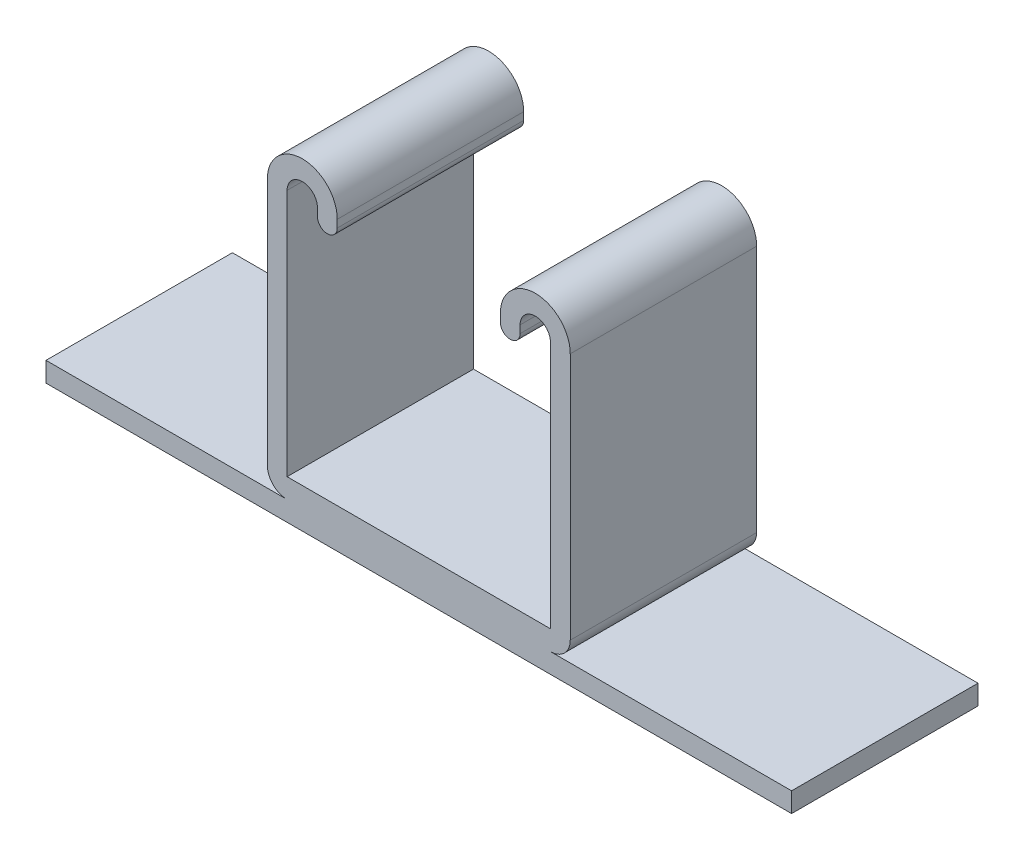
ISO-10303-21;
HEADER;
FILE_DESCRIPTION(('STEP AP214'),'2;1');
FILE_NAME('part.step','',(''),(''),'','','');
FILE_SCHEMA(('AUTOMOTIVE_DESIGN { 1 0 10303 214 1 1 1 1 }'));
ENDSEC;
DATA;
#1=APPLICATION_CONTEXT('core data for automotive mechanical design processes');
#2=APPLICATION_PROTOCOL_DEFINITION('international standard','automotive_design',2000,#1);
#3=PRODUCT_CONTEXT('',#1,'mechanical');
#4=PRODUCT('Part','Part','',(#3));
#5=PRODUCT_RELATED_PRODUCT_CATEGORY('part','',(#4));
#6=PRODUCT_DEFINITION_FORMATION('','',#4);
#7=PRODUCT_DEFINITION_CONTEXT('part definition',#1,'design');
#8=PRODUCT_DEFINITION('design','',#6,#7);
#9=PRODUCT_DEFINITION_SHAPE('','',#8);
#10=(LENGTH_UNIT() NAMED_UNIT(*) SI_UNIT(.MILLI.,.METRE.));
#11=(NAMED_UNIT(*) PLANE_ANGLE_UNIT() SI_UNIT($,.RADIAN.));
#12=(NAMED_UNIT(*) SI_UNIT($,.STERADIAN.) SOLID_ANGLE_UNIT());
#13=UNCERTAINTY_MEASURE_WITH_UNIT(LENGTH_MEASURE(1.E-05),#10,'distance_accuracy_value','');
#14=(GEOMETRIC_REPRESENTATION_CONTEXT(3) GLOBAL_UNCERTAINTY_ASSIGNED_CONTEXT((#13)) GLOBAL_UNIT_ASSIGNED_CONTEXT((#10,
#11,#12)) REPRESENTATION_CONTEXT('',''));
#15=CARTESIAN_POINT('',(0.,0.,0.));
#16=DIRECTION('',(0.,0.,1.));
#17=DIRECTION('',(1.,0.,0.));
#18=AXIS2_PLACEMENT_3D('',#15,#16,#17);
#19=CARTESIAN_POINT('',(-15.875,26.8351,12.7));
#20=DIRECTION('',(0.,0.,-1.));
#21=DIRECTION('',(-1.,0.,0.));
#22=AXIS2_PLACEMENT_3D('',#19,#20,#21);
#23=CYLINDRICAL_SURFACE('',#22,4.7625);
#24=CARTESIAN_POINT('',(-15.875,26.8351,-12.7));
#25=DIRECTION('',(0.,0.,1.));
#26=DIRECTION('',(-1.,0.,0.));
#27=AXIS2_PLACEMENT_3D('',#24,#25,#26);
#28=CIRCLE('',#27,4.7625);
#29=CARTESIAN_POINT('',(-11.1125,26.8351,-12.7));
#30=VERTEX_POINT('',#29);
#31=CARTESIAN_POINT('',(-20.6375,26.8351,-12.7));
#32=VERTEX_POINT('',#31);
#33=EDGE_CURVE('E212',#30,#32,#28,.T.);
#34=ORIENTED_EDGE('',*,*,#33,.T.);
#35=DIRECTION('',(0.,0.,-1.));
#36=VECTOR('',#35,1.);
#37=CARTESIAN_POINT('',(-20.6375,26.8351,12.7));
#38=LINE('',#37,#36);
#39=CARTESIAN_POINT('',(-20.6375,26.8351,12.7));
#40=VERTEX_POINT('',#39);
#41=EDGE_CURVE('E11',#40,#32,#38,.T.);
#42=ORIENTED_EDGE('',*,*,#41,.F.);
#43=CARTESIAN_POINT('',(-15.875,26.8351,12.7));
#44=DIRECTION('',(0.,0.,1.));
#45=DIRECTION('',(-1.,0.,0.));
#46=AXIS2_PLACEMENT_3D('',#43,#44,#45);
#47=CIRCLE('',#46,4.7625);
#48=CARTESIAN_POINT('',(-11.1125,26.8351,12.7));
#49=VERTEX_POINT('',#48);
#50=EDGE_CURVE('E254',#49,#40,#47,.T.);
#51=ORIENTED_EDGE('',*,*,#50,.F.);
#52=DIRECTION('',(0.,0.,-1.));
#53=VECTOR('',#52,1.);
#54=CARTESIAN_POINT('',(-11.1125,26.8351,12.7));
#55=LINE('',#54,#53);
#56=EDGE_CURVE('E208',#49,#30,#55,.T.);
#57=ORIENTED_EDGE('',*,*,#56,.T.);
#58=EDGE_LOOP('',(#34,#42,#51,#57));
#59=FACE_BOUND('',#58,.T.);
#60=ADVANCED_FACE('F32',(#59),#23,.T.);
#61=CARTESIAN_POINT('',(-20.6375,26.8351,12.7));
#62=DIRECTION('',(1.,0.,0.));
#63=DIRECTION('',(0.,0.,-1.));
#64=AXIS2_PLACEMENT_3D('',#61,#62,#63);
#65=PLANE('',#64);
#66=DIRECTION('',(0.,-1.,0.));
#67=VECTOR('',#66,1.);
#68=CARTESIAN_POINT('',(-20.6375,26.8351,-12.7));
#69=LINE('',#68,#67);
#70=CARTESIAN_POINT('',(-20.6375,-6.95960000000098,-12.7));
#71=VERTEX_POINT('',#70);
#72=EDGE_CURVE('E215',#32,#71,#69,.T.);
#73=ORIENTED_EDGE('',*,*,#72,.T.);
#74=DIRECTION('',(0.,0.,-1.));
#75=VECTOR('',#74,1.);
#76=CARTESIAN_POINT('',(-20.6375,-6.95960000000098,12.7));
#77=LINE('',#76,#75);
#78=CARTESIAN_POINT('',(-20.6375,-6.95960000000098,12.7));
#79=VERTEX_POINT('',#78);
#80=EDGE_CURVE('E40',#79,#71,#77,.T.);
#81=ORIENTED_EDGE('',*,*,#80,.F.);
#82=DIRECTION('',(0.,-1.,0.));
#83=VECTOR('',#82,1.);
#84=CARTESIAN_POINT('',(-20.6375,26.8351,12.7));
#85=LINE('',#84,#83);
#86=EDGE_CURVE('E133',#40,#79,#85,.T.);
#87=ORIENTED_EDGE('',*,*,#86,.F.);
#88=ORIENTED_EDGE('',*,*,#41,.T.);
#89=EDGE_LOOP('',(#73,#81,#87,#88));
#90=FACE_BOUND('',#89,.T.);
#91=ADVANCED_FACE('F382',(#90),#65,.F.);
#92=CARTESIAN_POINT('',(-17.9451,-6.95960000000098,12.7));
#93=DIRECTION('',(0.,0.,-1.));
#94=DIRECTION('',(-1.,0.,0.));
#95=AXIS2_PLACEMENT_3D('',#92,#93,#94);
#96=CYLINDRICAL_SURFACE('',#95,2.69239999999944);
#97=CARTESIAN_POINT('',(-17.9451,-6.95960000000098,-12.7));
#98=DIRECTION('',(0.,0.,1.));
#99=DIRECTION('',(-1.,0.,0.));
#100=AXIS2_PLACEMENT_3D('',#97,#98,#99);
#101=CIRCLE('',#100,2.69239999999944);
#102=CARTESIAN_POINT('',(-17.9451,-9.65200000000042,-12.7));
#103=VERTEX_POINT('',#102);
#104=EDGE_CURVE('E217',#71,#103,#101,.T.);
#105=ORIENTED_EDGE('',*,*,#104,.T.);
#106=DIRECTION('',(0.,0.,-1.));
#107=VECTOR('',#106,1.);
#108=CARTESIAN_POINT('',(-17.9451,-9.65200000000042,12.7));
#109=LINE('',#108,#107);
#110=CARTESIAN_POINT('',(-17.9451,-9.65200000000042,12.7));
#111=VERTEX_POINT('',#110);
#112=EDGE_CURVE('E303',#111,#103,#109,.T.);
#113=ORIENTED_EDGE('',*,*,#112,.F.);
#114=CARTESIAN_POINT('',(-17.9451,-6.95960000000098,12.7));
#115=DIRECTION('',(0.,0.,1.));
#116=DIRECTION('',(-1.,0.,0.));
#117=AXIS2_PLACEMENT_3D('',#114,#115,#116);
#118=CIRCLE('',#117,2.69239999999944);
#119=EDGE_CURVE('E311',#79,#111,#118,.T.);
#120=ORIENTED_EDGE('',*,*,#119,.F.);
#121=ORIENTED_EDGE('',*,*,#80,.T.);
#122=EDGE_LOOP('',(#105,#113,#120,#121));
#123=FACE_BOUND('',#122,.T.);
#124=ADVANCED_FACE('F309',(#123),#96,.T.);
#125=CARTESIAN_POINT('',(-50.8,-9.65200000000072,12.7));
#126=DIRECTION('',(0.,-1.,0.));
#127=DIRECTION('',(1.,0.,0.));
#128=AXIS2_PLACEMENT_3D('',#125,#126,#127);
#129=PLANE('',#128);
#130=DIRECTION('',(-1.,0.,0.));
#131=VECTOR('',#130,1.);
#132=CARTESIAN_POINT('',(-50.8,-9.65200000000072,-12.7));
#133=LINE('',#132,#131);
#134=CARTESIAN_POINT('',(-50.8,-9.65200000000072,-12.7));
#135=VERTEX_POINT('',#134);
#136=EDGE_CURVE('E219',#103,#135,#133,.T.);
#137=ORIENTED_EDGE('',*,*,#136,.T.);
#138=DIRECTION('',(0.,0.,-1.));
#139=VECTOR('',#138,1.);
#140=CARTESIAN_POINT('',(-50.8,-9.65200000000072,12.7));
#141=LINE('',#140,#139);
#142=CARTESIAN_POINT('',(-50.8,-9.65200000000072,12.7));
#143=VERTEX_POINT('',#142);
#144=EDGE_CURVE('E300',#143,#135,#141,.T.);
#145=ORIENTED_EDGE('',*,*,#144,.F.);
#146=DIRECTION('',(-1.,0.,0.));
#147=VECTOR('',#146,1.);
#148=CARTESIAN_POINT('',(-50.8,-9.65200000000072,12.7));
#149=LINE('',#148,#147);
#150=EDGE_CURVE('E329',#111,#143,#149,.T.);
#151=ORIENTED_EDGE('',*,*,#150,.F.);
#152=ORIENTED_EDGE('',*,*,#112,.T.);
#153=EDGE_LOOP('',(#137,#145,#151,#152));
#154=FACE_BOUND('',#153,.T.);
#155=ADVANCED_FACE('F320',(#154),#129,.F.);
#156=CARTESIAN_POINT('',(-50.8,-12.3444000000007,12.7));
#157=DIRECTION('',(1.,0.,0.));
#158=DIRECTION('',(0.,1.,0.));
#159=AXIS2_PLACEMENT_3D('',#156,#157,#158);
#160=PLANE('',#159);
#161=DIRECTION('',(0.,-1.,0.));
#162=VECTOR('',#161,1.);
#163=CARTESIAN_POINT('',(-50.8,-12.3444000000007,-12.7));
#164=LINE('',#163,#162);
#165=CARTESIAN_POINT('',(-50.8,-12.3444000000007,-12.7));
#166=VERTEX_POINT('',#165);
#167=EDGE_CURVE('E221',#135,#166,#164,.T.);
#168=ORIENTED_EDGE('',*,*,#167,.T.);
#169=DIRECTION('',(0.,0.,-1.));
#170=VECTOR('',#169,1.);
#171=CARTESIAN_POINT('',(-50.8,-12.3444000000007,12.7));
#172=LINE('',#171,#170);
#173=CARTESIAN_POINT('',(-50.8,-12.3444000000007,12.7));
#174=VERTEX_POINT('',#173);
#175=EDGE_CURVE('E297',#174,#166,#172,.T.);
#176=ORIENTED_EDGE('',*,*,#175,.F.);
#177=DIRECTION('',(0.,-1.,0.));
#178=VECTOR('',#177,1.);
#179=CARTESIAN_POINT('',(-50.8,-12.3444000000007,12.7));
#180=LINE('',#179,#178);
#181=EDGE_CURVE('E326',#143,#174,#180,.T.);
#182=ORIENTED_EDGE('',*,*,#181,.F.);
#183=ORIENTED_EDGE('',*,*,#144,.T.);
#184=EDGE_LOOP('',(#168,#176,#182,#183));
#185=FACE_BOUND('',#184,.T.);
#186=ADVANCED_FACE('F324',(#185),#160,.F.);
#187=CARTESIAN_POINT('',(50.8,-12.3444000000015,12.7));
#188=DIRECTION('',(0.,1.,0.));
#189=DIRECTION('',(-1.,0.,0.));
#190=AXIS2_PLACEMENT_3D('',#187,#188,#189);
#191=PLANE('',#190);
#192=DIRECTION('',(1.,0.,0.));
#193=VECTOR('',#192,1.);
#194=CARTESIAN_POINT('',(50.8,-12.3444000000015,-12.7));
#195=LINE('',#194,#193);
#196=CARTESIAN_POINT('',(50.8,-12.3444000000015,-12.7));
#197=VERTEX_POINT('',#196);
#198=EDGE_CURVE('E223',#166,#197,#195,.T.);
#199=ORIENTED_EDGE('',*,*,#198,.T.);
#200=DIRECTION('',(0.,0.,-1.));
#201=VECTOR('',#200,1.);
#202=CARTESIAN_POINT('',(50.8,-12.3444000000015,12.7));
#203=LINE('',#202,#201);
#204=CARTESIAN_POINT('',(50.8,-12.3444000000015,12.7));
#205=VERTEX_POINT('',#204);
#206=EDGE_CURVE('E294',#205,#197,#203,.T.);
#207=ORIENTED_EDGE('',*,*,#206,.F.);
#208=DIRECTION('',(1.,0.,0.));
#209=VECTOR('',#208,1.);
#210=CARTESIAN_POINT('',(50.8,-12.3444000000015,12.7));
#211=LINE('',#210,#209);
#212=EDGE_CURVE('E328',#174,#205,#211,.T.);
#213=ORIENTED_EDGE('',*,*,#212,.F.);
#214=ORIENTED_EDGE('',*,*,#175,.T.);
#215=EDGE_LOOP('',(#199,#207,#213,#214));
#216=FACE_BOUND('',#215,.T.);
#217=ADVANCED_FACE('F395',(#216),#191,.F.);
#218=CARTESIAN_POINT('',(50.8,-9.65200000000152,12.7));
#219=DIRECTION('',(-1.,0.,0.));
#220=DIRECTION('',(0.,0.,1.));
#221=AXIS2_PLACEMENT_3D('',#218,#219,#220);
#222=PLANE('',#221);
#223=DIRECTION('',(0.,1.,0.));
#224=VECTOR('',#223,1.);
#225=CARTESIAN_POINT('',(50.8,-9.65200000000152,-12.7));
#226=LINE('',#225,#224);
#227=CARTESIAN_POINT('',(50.8,-9.65200000000152,-12.7));
#228=VERTEX_POINT('',#227);
#229=EDGE_CURVE('E225',#197,#228,#226,.T.);
#230=ORIENTED_EDGE('',*,*,#229,.T.);
#231=DIRECTION('',(0.,0.,-1.));
#232=VECTOR('',#231,1.);
#233=CARTESIAN_POINT('',(50.8,-9.65200000000152,12.7));
#234=LINE('',#233,#232);
#235=CARTESIAN_POINT('',(50.8,-9.65200000000152,12.7));
#236=VERTEX_POINT('',#235);
#237=EDGE_CURVE('E291',#236,#228,#234,.T.);
#238=ORIENTED_EDGE('',*,*,#237,.F.);
#239=DIRECTION('',(0.,1.,0.));
#240=VECTOR('',#239,1.);
#241=CARTESIAN_POINT('',(50.8,-9.65200000000152,12.7));
#242=LINE('',#241,#240);
#243=EDGE_CURVE('E331',#205,#236,#242,.T.);
#244=ORIENTED_EDGE('',*,*,#243,.F.);
#245=ORIENTED_EDGE('',*,*,#206,.T.);
#246=EDGE_LOOP('',(#230,#238,#244,#245));
#247=FACE_BOUND('',#246,.T.);
#248=ADVANCED_FACE('F398',(#247),#222,.F.);
#249=CARTESIAN_POINT('',(17.9451,-9.65200000000126,12.7));
#250=DIRECTION('',(0.,-1.,0.));
#251=DIRECTION('',(1.,0.,0.));
#252=AXIS2_PLACEMENT_3D('',#249,#250,#251);
#253=PLANE('',#252);
#254=DIRECTION('',(-1.,0.,0.));
#255=VECTOR('',#254,1.);
#256=CARTESIAN_POINT('',(17.9451,-9.65200000000126,-12.7));
#257=LINE('',#256,#255);
#258=CARTESIAN_POINT('',(17.9451,-9.65200000000126,-12.7));
#259=VERTEX_POINT('',#258);
#260=EDGE_CURVE('E227',#228,#259,#257,.T.);
#261=ORIENTED_EDGE('',*,*,#260,.T.);
#262=DIRECTION('',(0.,0.,-1.));
#263=VECTOR('',#262,1.);
#264=CARTESIAN_POINT('',(17.9451,-9.65200000000126,12.7));
#265=LINE('',#264,#263);
#266=CARTESIAN_POINT('',(17.9451,-9.65200000000126,12.7));
#267=VERTEX_POINT('',#266);
#268=EDGE_CURVE('E288',#267,#259,#265,.T.);
#269=ORIENTED_EDGE('',*,*,#268,.F.);
#270=DIRECTION('',(-1.,0.,0.));
#271=VECTOR('',#270,1.);
#272=CARTESIAN_POINT('',(17.9451,-9.65200000000126,12.7));
#273=LINE('',#272,#271);
#274=EDGE_CURVE('E337',#236,#267,#273,.T.);
#275=ORIENTED_EDGE('',*,*,#274,.F.);
#276=ORIENTED_EDGE('',*,*,#237,.T.);
#277=EDGE_LOOP('',(#261,#269,#275,#276));
#278=FACE_BOUND('',#277,.T.);
#279=ADVANCED_FACE('F402',(#278),#253,.F.);
#280=CARTESIAN_POINT('',(17.9451,-6.95960000000015,12.7));
#281=DIRECTION('',(0.,0.,-1.));
#282=DIRECTION('',(-1.,0.,0.));
#283=AXIS2_PLACEMENT_3D('',#280,#281,#282);
#284=CYLINDRICAL_SURFACE('',#283,2.69240000000055);
#285=CARTESIAN_POINT('',(17.9451,-6.95960000000015,-12.7));
#286=DIRECTION('',(0.,0.,1.));
#287=DIRECTION('',(1.,0.,0.));
#288=AXIS2_PLACEMENT_3D('',#285,#286,#287);
#289=CIRCLE('',#288,2.69240000000055);
#290=CARTESIAN_POINT('',(20.6375000000005,-6.95960000000126,-12.7));
#291=VERTEX_POINT('',#290);
#292=EDGE_CURVE('E229',#259,#291,#289,.T.);
#293=ORIENTED_EDGE('',*,*,#292,.T.);
#294=DIRECTION('',(0.,0.,-1.));
#295=VECTOR('',#294,1.);
#296=CARTESIAN_POINT('',(20.6375000000005,-6.95960000000126,12.7));
#297=LINE('',#296,#295);
#298=CARTESIAN_POINT('',(20.6375000000005,-6.95960000000126,12.7));
#299=VERTEX_POINT('',#298);
#300=EDGE_CURVE('E285',#299,#291,#297,.T.);
#301=ORIENTED_EDGE('',*,*,#300,.F.);
#302=CARTESIAN_POINT('',(17.9451,-6.95960000000015,12.7));
#303=DIRECTION('',(0.,0.,1.));
#304=DIRECTION('',(1.,0.,0.));
#305=AXIS2_PLACEMENT_3D('',#302,#303,#304);
#306=CIRCLE('',#305,2.69240000000055);
#307=EDGE_CURVE('E339',#267,#299,#306,.T.);
#308=ORIENTED_EDGE('',*,*,#307,.F.);
#309=ORIENTED_EDGE('',*,*,#268,.T.);
#310=EDGE_LOOP('',(#293,#301,#308,#309));
#311=FACE_BOUND('',#310,.T.);
#312=ADVANCED_FACE('F406',(#311),#284,.T.);
#313=CARTESIAN_POINT('',(20.6375,-6.95960000000126,12.7));
#314=DIRECTION('',(-1.,0.,0.));
#315=DIRECTION('',(0.,-1.,0.));
#316=AXIS2_PLACEMENT_3D('',#313,#314,#315);
#317=PLANE('',#316);
#318=DIRECTION('',(0.,1.,0.));
#319=VECTOR('',#318,1.);
#320=CARTESIAN_POINT('',(20.6375,-6.95960000000126,-12.7));
#321=LINE('',#320,#319);
#322=CARTESIAN_POINT('',(20.6375,26.8351,-12.7));
#323=VERTEX_POINT('',#322);
#324=EDGE_CURVE('E231',#291,#323,#321,.T.);
#325=ORIENTED_EDGE('',*,*,#324,.T.);
#326=DIRECTION('',(0.,0.,-1.));
#327=VECTOR('',#326,1.);
#328=CARTESIAN_POINT('',(20.6375,26.8351,12.7));
#329=LINE('',#328,#327);
#330=CARTESIAN_POINT('',(20.6375,26.8351,12.7));
#331=VERTEX_POINT('',#330);
#332=EDGE_CURVE('E282',#331,#323,#329,.T.);
#333=ORIENTED_EDGE('',*,*,#332,.F.);
#334=DIRECTION('',(0.,1.,0.));
#335=VECTOR('',#334,1.);
#336=CARTESIAN_POINT('',(20.6375,-6.95960000000126,12.7));
#337=LINE('',#336,#335);
#338=EDGE_CURVE('E341',#299,#331,#337,.T.);
#339=ORIENTED_EDGE('',*,*,#338,.F.);
#340=ORIENTED_EDGE('',*,*,#300,.T.);
#341=EDGE_LOOP('',(#325,#333,#339,#340));
#342=FACE_BOUND('',#341,.T.);
#343=ADVANCED_FACE('F410',(#342),#317,.F.);
#344=CARTESIAN_POINT('',(15.875,26.8351,12.7));
#345=DIRECTION('',(0.,0.,-1.));
#346=DIRECTION('',(-1.,0.,0.));
#347=AXIS2_PLACEMENT_3D('',#344,#345,#346);
#348=CYLINDRICAL_SURFACE('',#347,4.7625);
#349=CARTESIAN_POINT('',(15.875,26.8351,-12.7));
#350=DIRECTION('',(0.,0.,1.));
#351=DIRECTION('',(1.,0.,0.));
#352=AXIS2_PLACEMENT_3D('',#349,#350,#351);
#353=CIRCLE('',#352,4.7625);
#354=CARTESIAN_POINT('',(11.1125,26.8351,-12.7));
#355=VERTEX_POINT('',#354);
#356=EDGE_CURVE('E233',#323,#355,#353,.T.);
#357=ORIENTED_EDGE('',*,*,#356,.T.);
#358=DIRECTION('',(0.,0.,-1.));
#359=VECTOR('',#358,1.);
#360=CARTESIAN_POINT('',(11.1125,26.8351,12.7));
#361=LINE('',#360,#359);
#362=CARTESIAN_POINT('',(11.1125,26.8351,12.7));
#363=VERTEX_POINT('',#362);
#364=EDGE_CURVE('E279',#363,#355,#361,.T.);
#365=ORIENTED_EDGE('',*,*,#364,.F.);
#366=CARTESIAN_POINT('',(15.875,26.8351,12.7));
#367=DIRECTION('',(0.,0.,1.));
#368=DIRECTION('',(1.,0.,0.));
#369=AXIS2_PLACEMENT_3D('',#366,#367,#368);
#370=CIRCLE('',#369,4.7625);
#371=EDGE_CURVE('E343',#331,#363,#370,.T.);
#372=ORIENTED_EDGE('',*,*,#371,.F.);
#373=ORIENTED_EDGE('',*,*,#332,.T.);
#374=EDGE_LOOP('',(#357,#365,#372,#373));
#375=FACE_BOUND('',#374,.T.);
#376=ADVANCED_FACE('F414',(#375),#348,.T.);
#377=CARTESIAN_POINT('',(11.1125,26.8351,12.7));
#378=DIRECTION('',(1.,0.,0.));
#379=DIRECTION('',(0.,1.,0.));
#380=AXIS2_PLACEMENT_3D('',#377,#378,#379);
#381=PLANE('',#380);
#382=DIRECTION('',(0.,-1.,0.));
#383=VECTOR('',#382,1.);
#384=CARTESIAN_POINT('',(11.1125,26.8351,-12.7));
#385=LINE('',#384,#383);
#386=CARTESIAN_POINT('',(11.1125,25.80005,-12.7));
#387=VERTEX_POINT('',#386);
#388=EDGE_CURVE('E235',#355,#387,#385,.T.);
#389=ORIENTED_EDGE('',*,*,#388,.T.);
#390=DIRECTION('',(0.,0.,-1.));
#391=VECTOR('',#390,1.);
#392=CARTESIAN_POINT('',(11.1125,25.80005,12.7));
#393=LINE('',#392,#391);
#394=CARTESIAN_POINT('',(11.1125,25.80005,12.7));
#395=VERTEX_POINT('',#394);
#396=EDGE_CURVE('E276',#395,#387,#393,.T.);
#397=ORIENTED_EDGE('',*,*,#396,.F.);
#398=DIRECTION('',(0.,-1.,0.));
#399=VECTOR('',#398,1.);
#400=CARTESIAN_POINT('',(11.1125,26.8351,12.7));
#401=LINE('',#400,#399);
#402=EDGE_CURVE('E345',#363,#395,#401,.T.);
#403=ORIENTED_EDGE('',*,*,#402,.F.);
#404=ORIENTED_EDGE('',*,*,#364,.T.);
#405=EDGE_LOOP('',(#389,#397,#403,#404));
#406=FACE_BOUND('',#405,.T.);
#407=ADVANCED_FACE('F418',(#406),#381,.F.);
#408=CARTESIAN_POINT('',(12.4587,25.80005,12.7));
#409=DIRECTION('',(0.,0.,-1.));
#410=DIRECTION('',(-1.,0.,0.));
#411=AXIS2_PLACEMENT_3D('',#408,#409,#410);
#412=CYLINDRICAL_SURFACE('',#411,1.3462);
#413=CARTESIAN_POINT('',(12.4587,25.80005,-12.7));
#414=DIRECTION('',(0.,0.,1.));
#415=DIRECTION('',(1.,0.,0.));
#416=AXIS2_PLACEMENT_3D('',#413,#414,#415);
#417=CIRCLE('',#416,1.3462);
#418=CARTESIAN_POINT('',(13.8049,25.80005,-12.7));
#419=VERTEX_POINT('',#418);
#420=EDGE_CURVE('E237',#387,#419,#417,.T.);
#421=ORIENTED_EDGE('',*,*,#420,.T.);
#422=DIRECTION('',(0.,0.,-1.));
#423=VECTOR('',#422,1.);
#424=CARTESIAN_POINT('',(13.8049,25.80005,12.7));
#425=LINE('',#424,#423);
#426=CARTESIAN_POINT('',(13.8049,25.80005,12.7));
#427=VERTEX_POINT('',#426);
#428=EDGE_CURVE('E273',#427,#419,#425,.T.);
#429=ORIENTED_EDGE('',*,*,#428,.F.);
#430=CARTESIAN_POINT('',(12.4587,25.80005,12.7));
#431=DIRECTION('',(0.,0.,1.));
#432=DIRECTION('',(1.,0.,0.));
#433=AXIS2_PLACEMENT_3D('',#430,#431,#432);
#434=CIRCLE('',#433,1.3462);
#435=EDGE_CURVE('E347',#395,#427,#434,.T.);
#436=ORIENTED_EDGE('',*,*,#435,.F.);
#437=ORIENTED_EDGE('',*,*,#396,.T.);
#438=EDGE_LOOP('',(#421,#429,#436,#437));
#439=FACE_BOUND('',#438,.T.);
#440=ADVANCED_FACE('F422',(#439),#412,.T.);
#441=CARTESIAN_POINT('',(13.8049,26.8351,12.7));
#442=DIRECTION('',(-1.,0.,0.));
#443=DIRECTION('',(0.,0.,1.));
#444=AXIS2_PLACEMENT_3D('',#441,#442,#443);
#445=PLANE('',#444);
#446=DIRECTION('',(0.,1.,0.));
#447=VECTOR('',#446,1.);
#448=CARTESIAN_POINT('',(13.8049,26.8351,-12.7));
#449=LINE('',#448,#447);
#450=CARTESIAN_POINT('',(13.8049,26.8351,-12.7));
#451=VERTEX_POINT('',#450);
#452=EDGE_CURVE('E239',#419,#451,#449,.T.);
#453=ORIENTED_EDGE('',*,*,#452,.T.);
#454=DIRECTION('',(0.,0.,-1.));
#455=VECTOR('',#454,1.);
#456=CARTESIAN_POINT('',(13.8049,26.8351,12.7));
#457=LINE('',#456,#455);
#458=CARTESIAN_POINT('',(13.8049,26.8351,12.7));
#459=VERTEX_POINT('',#458);
#460=EDGE_CURVE('E270',#459,#451,#457,.T.);
#461=ORIENTED_EDGE('',*,*,#460,.F.);
#462=DIRECTION('',(0.,1.,0.));
#463=VECTOR('',#462,1.);
#464=CARTESIAN_POINT('',(13.8049,26.8351,12.7));
#465=LINE('',#464,#463);
#466=EDGE_CURVE('E349',#427,#459,#465,.T.);
#467=ORIENTED_EDGE('',*,*,#466,.F.);
#468=ORIENTED_EDGE('',*,*,#428,.T.);
#469=EDGE_LOOP('',(#453,#461,#467,#468));
#470=FACE_BOUND('',#469,.T.);
#471=ADVANCED_FACE('F426',(#470),#445,.F.);
#472=CARTESIAN_POINT('',(15.875,26.8351,12.7));
#473=DIRECTION('',(0.,0.,-1.));
#474=DIRECTION('',(-1.,0.,0.));
#475=AXIS2_PLACEMENT_3D('',#472,#473,#474);
#476=CYLINDRICAL_SURFACE('',#475,2.0701);
#477=CARTESIAN_POINT('',(15.875,26.8351,-12.7));
#478=DIRECTION('',(0.,0.,-1.));
#479=DIRECTION('',(1.,0.,0.));
#480=AXIS2_PLACEMENT_3D('',#477,#478,#479);
#481=CIRCLE('',#480,2.0701);
#482=CARTESIAN_POINT('',(17.9451,26.8351,-12.7));
#483=VERTEX_POINT('',#482);
#484=EDGE_CURVE('E241',#451,#483,#481,.T.);
#485=ORIENTED_EDGE('',*,*,#484,.T.);
#486=DIRECTION('',(0.,0.,-1.));
#487=VECTOR('',#486,1.);
#488=CARTESIAN_POINT('',(17.9451,26.8351,12.7));
#489=LINE('',#488,#487);
#490=CARTESIAN_POINT('',(17.9451,26.8351,12.7));
#491=VERTEX_POINT('',#490);
#492=EDGE_CURVE('E267',#491,#483,#489,.T.);
#493=ORIENTED_EDGE('',*,*,#492,.F.);
#494=CARTESIAN_POINT('',(15.875,26.8351,12.7));
#495=DIRECTION('',(0.,0.,-1.));
#496=DIRECTION('',(1.,0.,0.));
#497=AXIS2_PLACEMENT_3D('',#494,#495,#496);
#498=CIRCLE('',#497,2.0701);
#499=EDGE_CURVE('E351',#459,#491,#498,.T.);
#500=ORIENTED_EDGE('',*,*,#499,.F.);
#501=ORIENTED_EDGE('',*,*,#460,.T.);
#502=EDGE_LOOP('',(#485,#493,#500,#501));
#503=FACE_BOUND('',#502,.T.);
#504=ADVANCED_FACE('F430',(#503),#476,.F.);
#505=CARTESIAN_POINT('',(17.9451,-6.95960000000129,12.7));
#506=DIRECTION('',(1.,0.,0.));
#507=DIRECTION('',(0.,1.,0.));
#508=AXIS2_PLACEMENT_3D('',#505,#506,#507);
#509=PLANE('',#508);
#510=DIRECTION('',(0.,-1.,0.));
#511=VECTOR('',#510,1.);
#512=CARTESIAN_POINT('',(17.9451,-6.95960000000129,-12.7));
#513=LINE('',#512,#511);
#514=CARTESIAN_POINT('',(17.9451,-6.95960000000129,-12.7));
#515=VERTEX_POINT('',#514);
#516=EDGE_CURVE('E243',#483,#515,#513,.T.);
#517=ORIENTED_EDGE('',*,*,#516,.T.);
#518=DIRECTION('',(0.,0.,-1.));
#519=VECTOR('',#518,1.);
#520=CARTESIAN_POINT('',(17.9451,-6.95960000000129,12.7));
#521=LINE('',#520,#519);
#522=CARTESIAN_POINT('',(17.9451,-6.95960000000129,12.7));
#523=VERTEX_POINT('',#522);
#524=EDGE_CURVE('E264',#523,#515,#521,.T.);
#525=ORIENTED_EDGE('',*,*,#524,.F.);
#526=DIRECTION('',(0.,-1.,0.));
#527=VECTOR('',#526,1.);
#528=CARTESIAN_POINT('',(17.9451,-6.95960000000129,12.7));
#529=LINE('',#528,#527);
#530=EDGE_CURVE('E353',#491,#523,#529,.T.);
#531=ORIENTED_EDGE('',*,*,#530,.F.);
#532=ORIENTED_EDGE('',*,*,#492,.T.);
#533=EDGE_LOOP('',(#517,#525,#531,#532));
#534=FACE_BOUND('',#533,.T.);
#535=ADVANCED_FACE('F434',(#534),#509,.F.);
#536=CARTESIAN_POINT('',(-17.9451,-6.95960000000101,12.7));
#537=DIRECTION('',(0.,-1.,0.));
#538=DIRECTION('',(1.,0.,0.));
#539=AXIS2_PLACEMENT_3D('',#536,#537,#538);
#540=PLANE('',#539);
#541=DIRECTION('',(-1.,0.,0.));
#542=VECTOR('',#541,1.);
#543=CARTESIAN_POINT('',(-17.9451,-6.95960000000101,-12.7));
#544=LINE('',#543,#542);
#545=CARTESIAN_POINT('',(-17.9451,-6.95960000000101,-12.7));
#546=VERTEX_POINT('',#545);
#547=EDGE_CURVE('E245',#515,#546,#544,.T.);
#548=ORIENTED_EDGE('',*,*,#547,.T.);
#549=DIRECTION('',(0.,0.,-1.));
#550=VECTOR('',#549,1.);
#551=CARTESIAN_POINT('',(-17.9451,-6.95960000000101,12.7));
#552=LINE('',#551,#550);
#553=CARTESIAN_POINT('',(-17.9451,-6.95960000000101,12.7));
#554=VERTEX_POINT('',#553);
#555=EDGE_CURVE('E261',#554,#546,#552,.T.);
#556=ORIENTED_EDGE('',*,*,#555,.F.);
#557=DIRECTION('',(-1.,0.,0.));
#558=VECTOR('',#557,1.);
#559=CARTESIAN_POINT('',(-17.9451,-6.95960000000101,12.7));
#560=LINE('',#559,#558);
#561=EDGE_CURVE('E355',#523,#554,#560,.T.);
#562=ORIENTED_EDGE('',*,*,#561,.F.);
#563=ORIENTED_EDGE('',*,*,#524,.T.);
#564=EDGE_LOOP('',(#548,#556,#562,#563));
#565=FACE_BOUND('',#564,.T.);
#566=ADVANCED_FACE('F438',(#565),#540,.F.);
#567=CARTESIAN_POINT('',(-17.9451,26.8351,12.7));
#568=DIRECTION('',(-1.,0.,0.));
#569=DIRECTION('',(0.,-1.,0.));
#570=AXIS2_PLACEMENT_3D('',#567,#568,#569);
#571=PLANE('',#570);
#572=DIRECTION('',(0.,1.,0.));
#573=VECTOR('',#572,1.);
#574=CARTESIAN_POINT('',(-17.9451,26.8351,-12.7));
#575=LINE('',#574,#573);
#576=CARTESIAN_POINT('',(-17.9451,26.8351,-12.7));
#577=VERTEX_POINT('',#576);
#578=EDGE_CURVE('E247',#546,#577,#575,.T.);
#579=ORIENTED_EDGE('',*,*,#578,.T.);
#580=DIRECTION('',(0.,0.,-1.));
#581=VECTOR('',#580,1.);
#582=CARTESIAN_POINT('',(-17.9451,26.8351,12.7));
#583=LINE('',#582,#581);
#584=CARTESIAN_POINT('',(-17.9451,26.8351,12.7));
#585=VERTEX_POINT('',#584);
#586=EDGE_CURVE('E258',#585,#577,#583,.T.);
#587=ORIENTED_EDGE('',*,*,#586,.F.);
#588=DIRECTION('',(0.,1.,0.));
#589=VECTOR('',#588,1.);
#590=CARTESIAN_POINT('',(-17.9451,26.8351,12.7));
#591=LINE('',#590,#589);
#592=EDGE_CURVE('E357',#554,#585,#591,.T.);
#593=ORIENTED_EDGE('',*,*,#592,.F.);
#594=ORIENTED_EDGE('',*,*,#555,.T.);
#595=EDGE_LOOP('',(#579,#587,#593,#594));
#596=FACE_BOUND('',#595,.T.);
#597=ADVANCED_FACE('F363',(#596),#571,.F.);
#598=CARTESIAN_POINT('',(-15.875,26.8351,12.7));
#599=DIRECTION('',(0.,0.,-1.));
#600=DIRECTION('',(-1.,0.,0.));
#601=AXIS2_PLACEMENT_3D('',#598,#599,#600);
#602=CYLINDRICAL_SURFACE('',#601,2.0701);
#603=CARTESIAN_POINT('',(-15.875,26.8351,-12.7));
#604=DIRECTION('',(0.,0.,-1.));
#605=DIRECTION('',(-1.,0.,0.));
#606=AXIS2_PLACEMENT_3D('',#603,#604,#605);
#607=CIRCLE('',#606,2.0701);
#608=CARTESIAN_POINT('',(-13.8049,26.8351,-12.7));
#609=VERTEX_POINT('',#608);
#610=EDGE_CURVE('E249',#577,#609,#607,.T.);
#611=ORIENTED_EDGE('',*,*,#610,.T.);
#612=DIRECTION('',(0.,0.,-1.));
#613=VECTOR('',#612,1.);
#614=CARTESIAN_POINT('',(-13.8049,26.8351,12.7));
#615=LINE('',#614,#613);
#616=CARTESIAN_POINT('',(-13.8049,26.8351,12.7));
#617=VERTEX_POINT('',#616);
#618=EDGE_CURVE('E203',#617,#609,#615,.T.);
#619=ORIENTED_EDGE('',*,*,#618,.F.);
#620=CARTESIAN_POINT('',(-15.875,26.8351,12.7));
#621=DIRECTION('',(0.,0.,-1.));
#622=DIRECTION('',(-1.,0.,0.));
#623=AXIS2_PLACEMENT_3D('',#620,#621,#622);
#624=CIRCLE('',#623,2.0701);
#625=EDGE_CURVE('E194',#585,#617,#624,.T.);
#626=ORIENTED_EDGE('',*,*,#625,.F.);
#627=ORIENTED_EDGE('',*,*,#586,.T.);
#628=EDGE_LOOP('',(#611,#619,#626,#627));
#629=FACE_BOUND('',#628,.T.);
#630=ADVANCED_FACE('F367',(#629),#602,.F.);
#631=CARTESIAN_POINT('',(-13.8049,26.8351,12.7));
#632=DIRECTION('',(1.,0.,0.));
#633=DIRECTION('',(0.,1.,0.));
#634=AXIS2_PLACEMENT_3D('',#631,#632,#633);
#635=PLANE('',#634);
#636=DIRECTION('',(0.,-1.,0.));
#637=VECTOR('',#636,1.);
#638=CARTESIAN_POINT('',(-13.8049,26.8351,-12.7));
#639=LINE('',#638,#637);
#640=CARTESIAN_POINT('',(-13.8049,25.80005,-12.7));
#641=VERTEX_POINT('',#640);
#642=EDGE_CURVE('E202',#609,#641,#639,.T.);
#643=ORIENTED_EDGE('',*,*,#642,.T.);
#644=DIRECTION('',(0.,0.,-1.));
#645=VECTOR('',#644,1.);
#646=CARTESIAN_POINT('',(-13.8049,25.80005,12.7));
#647=LINE('',#646,#645);
#648=CARTESIAN_POINT('',(-13.8049,25.80005,12.7));
#649=VERTEX_POINT('',#648);
#650=EDGE_CURVE('E199',#649,#641,#647,.T.);
#651=ORIENTED_EDGE('',*,*,#650,.F.);
#652=DIRECTION('',(0.,-1.,0.));
#653=VECTOR('',#652,1.);
#654=CARTESIAN_POINT('',(-13.8049,26.8351,12.7));
#655=LINE('',#654,#653);
#656=EDGE_CURVE('E188',#617,#649,#655,.T.);
#657=ORIENTED_EDGE('',*,*,#656,.F.);
#658=ORIENTED_EDGE('',*,*,#618,.T.);
#659=EDGE_LOOP('',(#643,#651,#657,#658));
#660=FACE_BOUND('',#659,.T.);
#661=ADVANCED_FACE('F200',(#660),#635,.F.);
#662=CARTESIAN_POINT('',(-12.4587,25.80005,12.7));
#663=DIRECTION('',(0.,0.,-1.));
#664=DIRECTION('',(-1.,0.,0.));
#665=AXIS2_PLACEMENT_3D('',#662,#663,#664);
#666=CYLINDRICAL_SURFACE('',#665,1.3462);
#667=CARTESIAN_POINT('',(-12.4587,25.80005,-12.7));
#668=DIRECTION('',(0.,0.,1.));
#669=DIRECTION('',(-1.,0.,0.));
#670=AXIS2_PLACEMENT_3D('',#667,#668,#669);
#671=CIRCLE('',#670,1.3462);
#672=CARTESIAN_POINT('',(-11.1125,25.80005,-12.7));
#673=VERTEX_POINT('',#672);
#674=EDGE_CURVE('E119',#641,#673,#671,.T.);
#675=ORIENTED_EDGE('',*,*,#674,.T.);
#676=DIRECTION('',(0.,0.,-1.));
#677=VECTOR('',#676,1.);
#678=CARTESIAN_POINT('',(-11.1125,25.80005,12.7));
#679=LINE('',#678,#677);
#680=CARTESIAN_POINT('',(-11.1125,25.80005,12.7));
#681=VERTEX_POINT('',#680);
#682=EDGE_CURVE('E204',#681,#673,#679,.T.);
#683=ORIENTED_EDGE('',*,*,#682,.F.);
#684=CARTESIAN_POINT('',(-12.4587,25.80005,12.7));
#685=DIRECTION('',(0.,0.,1.));
#686=DIRECTION('',(-1.,0.,0.));
#687=AXIS2_PLACEMENT_3D('',#684,#685,#686);
#688=CIRCLE('',#687,1.3462);
#689=EDGE_CURVE('E192',#649,#681,#688,.T.);
#690=ORIENTED_EDGE('',*,*,#689,.F.);
#691=ORIENTED_EDGE('',*,*,#650,.T.);
#692=EDGE_LOOP('',(#675,#683,#690,#691));
#693=FACE_BOUND('',#692,.T.);
#694=ADVANCED_FACE('F206',(#693),#666,.T.);
#695=CARTESIAN_POINT('',(-11.1125,26.8351,12.7));
#696=DIRECTION('',(-1.,0.,0.));
#697=DIRECTION('',(0.,0.,1.));
#698=AXIS2_PLACEMENT_3D('',#695,#696,#697);
#699=PLANE('',#698);
#700=DIRECTION('',(0.,1.,0.));
#701=VECTOR('',#700,1.);
#702=CARTESIAN_POINT('',(-11.1125,26.8351,-12.7));
#703=LINE('',#702,#701);
#704=EDGE_CURVE('E125',#673,#30,#703,.T.);
#705=ORIENTED_EDGE('',*,*,#704,.T.);
#706=ORIENTED_EDGE('',*,*,#56,.F.);
#707=DIRECTION('',(0.,1.,0.));
#708=VECTOR('',#707,1.);
#709=CARTESIAN_POINT('',(-11.1125,26.8351,12.7));
#710=LINE('',#709,#708);
#711=EDGE_CURVE('E48',#681,#49,#710,.T.);
#712=ORIENTED_EDGE('',*,*,#711,.F.);
#713=ORIENTED_EDGE('',*,*,#682,.T.);
#714=EDGE_LOOP('',(#705,#706,#712,#713));
#715=FACE_BOUND('',#714,.T.);
#716=ADVANCED_FACE('F371',(#715),#699,.F.);
#717=CARTESIAN_POINT('',(-15.875,26.8351,12.7));
#718=DIRECTION('',(0.,0.,-1.));
#719=DIRECTION('',(-1.,0.,0.));
#720=AXIS2_PLACEMENT_3D('',#717,#718,#719);
#721=PLANE('',#720);
#722=ORIENTED_EDGE('',*,*,#50,.T.);
#723=ORIENTED_EDGE('',*,*,#86,.T.);
#724=ORIENTED_EDGE('',*,*,#119,.T.);
#725=ORIENTED_EDGE('',*,*,#150,.T.);
#726=ORIENTED_EDGE('',*,*,#181,.T.);
#727=ORIENTED_EDGE('',*,*,#212,.T.);
#728=ORIENTED_EDGE('',*,*,#243,.T.);
#729=ORIENTED_EDGE('',*,*,#274,.T.);
#730=ORIENTED_EDGE('',*,*,#307,.T.);
#731=ORIENTED_EDGE('',*,*,#338,.T.);
#732=ORIENTED_EDGE('',*,*,#371,.T.);
#733=ORIENTED_EDGE('',*,*,#402,.T.);
#734=ORIENTED_EDGE('',*,*,#435,.T.);
#735=ORIENTED_EDGE('',*,*,#466,.T.);
#736=ORIENTED_EDGE('',*,*,#499,.T.);
#737=ORIENTED_EDGE('',*,*,#530,.T.);
#738=ORIENTED_EDGE('',*,*,#561,.T.);
#739=ORIENTED_EDGE('',*,*,#592,.T.);
#740=ORIENTED_EDGE('',*,*,#625,.T.);
#741=ORIENTED_EDGE('',*,*,#656,.T.);
#742=ORIENTED_EDGE('',*,*,#689,.T.);
#743=ORIENTED_EDGE('',*,*,#711,.T.);
#744=EDGE_LOOP('',(#722,#723,#724,#725,#726,#727,#728,#729,#730,#731,#732,#733,#734,#735,#736,
#737,#738,#739,#740,#741,#742,#743));
#745=FACE_BOUND('',#744,.T.);
#746=ADVANCED_FACE('F190',(#745),#721,.F.);
#747=CARTESIAN_POINT('',(-15.875,26.8351,-12.7));
#748=DIRECTION('',(0.,0.,-1.));
#749=DIRECTION('',(-1.,0.,0.));
#750=AXIS2_PLACEMENT_3D('',#747,#748,#749);
#751=PLANE('',#750);
#752=ORIENTED_EDGE('',*,*,#33,.F.);
#753=ORIENTED_EDGE('',*,*,#704,.F.);
#754=ORIENTED_EDGE('',*,*,#674,.F.);
#755=ORIENTED_EDGE('',*,*,#642,.F.);
#756=ORIENTED_EDGE('',*,*,#610,.F.);
#757=ORIENTED_EDGE('',*,*,#578,.F.);
#758=ORIENTED_EDGE('',*,*,#547,.F.);
#759=ORIENTED_EDGE('',*,*,#516,.F.);
#760=ORIENTED_EDGE('',*,*,#484,.F.);
#761=ORIENTED_EDGE('',*,*,#452,.F.);
#762=ORIENTED_EDGE('',*,*,#420,.F.);
#763=ORIENTED_EDGE('',*,*,#388,.F.);
#764=ORIENTED_EDGE('',*,*,#356,.F.);
#765=ORIENTED_EDGE('',*,*,#324,.F.);
#766=ORIENTED_EDGE('',*,*,#292,.F.);
#767=ORIENTED_EDGE('',*,*,#260,.F.);
#768=ORIENTED_EDGE('',*,*,#229,.F.);
#769=ORIENTED_EDGE('',*,*,#198,.F.);
#770=ORIENTED_EDGE('',*,*,#167,.F.);
#771=ORIENTED_EDGE('',*,*,#136,.F.);
#772=ORIENTED_EDGE('',*,*,#104,.F.);
#773=ORIENTED_EDGE('',*,*,#72,.F.);
#774=EDGE_LOOP('',(#752,#753,#754,#755,#756,#757,#758,#759,#760,#761,#762,#763,#764,#765,#766,
#767,#768,#769,#770,#771,#772,#773));
#775=FACE_BOUND('',#774,.T.);
#776=ADVANCED_FACE('F315',(#775),#751,.T.);
#777=CLOSED_SHELL('',(#60,#91,#124,#155,#186,#217,#248,#279,#312,#343,#376,#407,#440,#471,#504,
#535,#566,#597,#630,#661,#694,#716,#746,#776));
#778=MANIFOLD_SOLID_BREP('B2',#777);
#779=ADVANCED_BREP_SHAPE_REPRESENTATION('',(#18,#778),#14);
#780=SHAPE_DEFINITION_REPRESENTATION(#9,#779);
ENDSEC;
END-ISO-10303-21;
